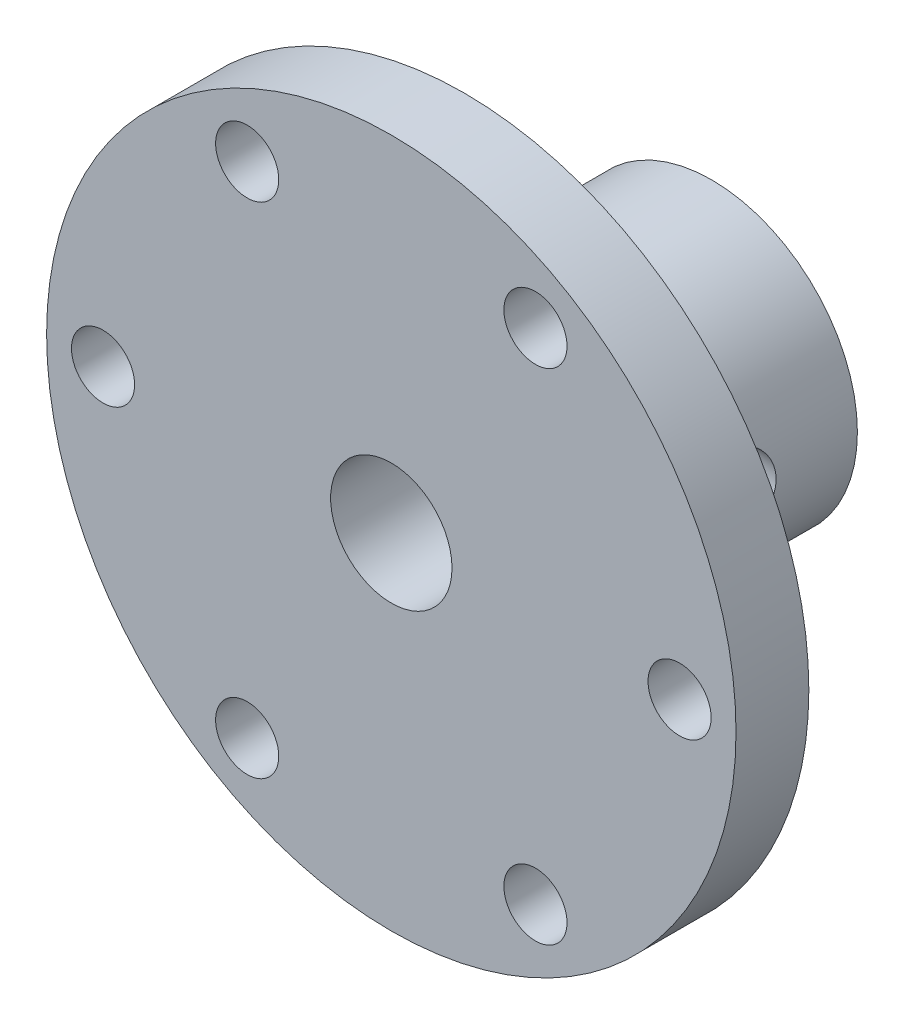
ISO-10303-21;
HEADER;
FILE_DESCRIPTION(('STEP AP214'),'2;1');
FILE_NAME('part.step','',(''),(''),'','','');
FILE_SCHEMA(('AUTOMOTIVE_DESIGN { 1 0 10303 214 1 1 1 1 }'));
ENDSEC;
DATA;
#1=APPLICATION_CONTEXT('core data for automotive mechanical design processes');
#2=APPLICATION_PROTOCOL_DEFINITION('international standard','automotive_design',2000,#1);
#3=PRODUCT_CONTEXT('',#1,'mechanical');
#4=PRODUCT('Part','Part','',(#3));
#5=PRODUCT_RELATED_PRODUCT_CATEGORY('part','',(#4));
#6=PRODUCT_DEFINITION_FORMATION('','',#4);
#7=PRODUCT_DEFINITION_CONTEXT('part definition',#1,'design');
#8=PRODUCT_DEFINITION('design','',#6,#7);
#9=PRODUCT_DEFINITION_SHAPE('','',#8);
#10=(LENGTH_UNIT() NAMED_UNIT(*) SI_UNIT(.MILLI.,.METRE.));
#11=(NAMED_UNIT(*) PLANE_ANGLE_UNIT() SI_UNIT($,.RADIAN.));
#12=(NAMED_UNIT(*) SI_UNIT($,.STERADIAN.) SOLID_ANGLE_UNIT());
#13=UNCERTAINTY_MEASURE_WITH_UNIT(LENGTH_MEASURE(1.E-05),#10,'distance_accuracy_value','');
#14=(GEOMETRIC_REPRESENTATION_CONTEXT(3) GLOBAL_UNCERTAINTY_ASSIGNED_CONTEXT((#13)) GLOBAL_UNIT_ASSIGNED_CONTEXT((#10,
#11,#12)) REPRESENTATION_CONTEXT('',''));
#15=CARTESIAN_POINT('',(0.,0.,0.));
#16=DIRECTION('',(0.,0.,1.));
#17=DIRECTION('',(1.,0.,0.));
#18=AXIS2_PLACEMENT_3D('',#15,#16,#17);
#19=CARTESIAN_POINT('',(0.,0.,6.));
#20=DIRECTION('',(0.,0.,-1.));
#21=DIRECTION('',(-1.,0.,0.));
#22=AXIS2_PLACEMENT_3D('',#19,#20,#21);
#23=CYLINDRICAL_SURFACE('',#22,28.4);
#24=CARTESIAN_POINT('',(0.,0.,6.));
#25=DIRECTION('',(0.,0.,1.));
#26=DIRECTION('',(1.,0.,0.));
#27=AXIS2_PLACEMENT_3D('',#24,#25,#26);
#28=CIRCLE('',#27,28.4);
#29=CARTESIAN_POINT('',(28.4,0.,6.));
#30=VERTEX_POINT('',#29);
#31=EDGE_CURVE('E11',#30,#30,#28,.T.);
#32=ORIENTED_EDGE('',*,*,#31,.F.);
#33=EDGE_LOOP('',(#32));
#34=FACE_BOUND('',#33,.T.);
#35=CARTESIAN_POINT('',(0.,0.,0.));
#36=DIRECTION('',(0.,0.,1.));
#37=DIRECTION('',(1.,0.,0.));
#38=AXIS2_PLACEMENT_3D('',#35,#36,#37);
#39=CIRCLE('',#38,28.4);
#40=CARTESIAN_POINT('',(28.4,0.,0.));
#41=VERTEX_POINT('',#40);
#42=EDGE_CURVE('E47',#41,#41,#39,.T.);
#43=ORIENTED_EDGE('',*,*,#42,.T.);
#44=EDGE_LOOP('',(#43));
#45=FACE_BOUND('',#44,.T.);
#46=ADVANCED_FACE('F39',(#34,#45),#23,.T.);
#47=CARTESIAN_POINT('',(0.,0.,6.));
#48=DIRECTION('',(0.,0.,1.));
#49=DIRECTION('',(1.,0.,0.));
#50=AXIS2_PLACEMENT_3D('',#47,#48,#49);
#51=PLANE('',#50);
#52=CARTESIAN_POINT('',(11.8750000000002,-20.5681033398803,6.));
#53=DIRECTION('',(0.,0.,1.));
#54=DIRECTION('',(0.50000000000001,-0.866025403784433,0.));
#55=AXIS2_PLACEMENT_3D('',#52,#53,#54);
#56=CIRCLE('',#55,2.6);
#57=CARTESIAN_POINT('',(13.1750000000003,-22.8197693897198,6.));
#58=VERTEX_POINT('',#57);
#59=EDGE_CURVE('E281',#58,#58,#56,.T.);
#60=ORIENTED_EDGE('',*,*,#59,.F.);
#61=EDGE_LOOP('',(#60));
#62=FACE_BOUND('',#61,.T.);
#63=CARTESIAN_POINT('',(-11.8749999999998,-20.5681033398805,6.));
#64=DIRECTION('',(0.,0.,1.));
#65=DIRECTION('',(-0.499999999999992,-0.866025403784443,0.));
#66=AXIS2_PLACEMENT_3D('',#63,#64,#65);
#67=CIRCLE('',#66,2.6);
#68=CARTESIAN_POINT('',(-13.1749999999998,-22.8197693897201,6.));
#69=VERTEX_POINT('',#68);
#70=EDGE_CURVE('E285',#69,#69,#67,.T.);
#71=ORIENTED_EDGE('',*,*,#70,.F.);
#72=EDGE_LOOP('',(#71));
#73=FACE_BOUND('',#72,.T.);
#74=CARTESIAN_POINT('',(-23.75,0.,6.));
#75=DIRECTION('',(0.,0.,1.));
#76=DIRECTION('',(-1.,0.,0.));
#77=AXIS2_PLACEMENT_3D('',#74,#75,#76);
#78=CIRCLE('',#77,2.6);
#79=CARTESIAN_POINT('',(-26.35,0.,6.));
#80=VERTEX_POINT('',#79);
#81=EDGE_CURVE('E289',#80,#80,#78,.T.);
#82=ORIENTED_EDGE('',*,*,#81,.F.);
#83=EDGE_LOOP('',(#82));
#84=FACE_BOUND('',#83,.T.);
#85=CARTESIAN_POINT('',(-11.8750000000001,20.5681033398804,6.));
#86=DIRECTION('',(0.,0.,1.));
#87=DIRECTION('',(-0.500000000000004,0.866025403784436,0.));
#88=AXIS2_PLACEMENT_3D('',#85,#86,#87);
#89=CIRCLE('',#88,2.6);
#90=CARTESIAN_POINT('',(-13.1750000000001,22.8197693897199,6.));
#91=VERTEX_POINT('',#90);
#92=EDGE_CURVE('E292',#91,#91,#89,.T.);
#93=ORIENTED_EDGE('',*,*,#92,.F.);
#94=EDGE_LOOP('',(#93));
#95=FACE_BOUND('',#94,.T.);
#96=CARTESIAN_POINT('',(11.875,20.5681033398804,6.));
#97=DIRECTION('',(0.,0.,1.));
#98=DIRECTION('',(0.499999999999998,0.86602540378444,0.));
#99=AXIS2_PLACEMENT_3D('',#96,#97,#98);
#100=CIRCLE('',#99,2.6);
#101=CARTESIAN_POINT('',(13.1749999999999,22.81976938972,6.));
#102=VERTEX_POINT('',#101);
#103=EDGE_CURVE('E69',#102,#102,#100,.T.);
#104=ORIENTED_EDGE('',*,*,#103,.F.);
#105=EDGE_LOOP('',(#104));
#106=FACE_BOUND('',#105,.T.);
#107=CARTESIAN_POINT('',(23.75,0.,6.));
#108=DIRECTION('',(0.,0.,1.));
#109=DIRECTION('',(1.,0.,0.));
#110=AXIS2_PLACEMENT_3D('',#107,#108,#109);
#111=CIRCLE('',#110,2.6);
#112=CARTESIAN_POINT('',(26.35,0.,6.));
#113=VERTEX_POINT('',#112);
#114=EDGE_CURVE('E63',#113,#113,#111,.T.);
#115=ORIENTED_EDGE('',*,*,#114,.F.);
#116=EDGE_LOOP('',(#115));
#117=FACE_BOUND('',#116,.T.);
#118=CARTESIAN_POINT('',(0.,0.,6.));
#119=DIRECTION('',(0.,0.,1.));
#120=DIRECTION('',(1.,0.,0.));
#121=AXIS2_PLACEMENT_3D('',#118,#119,#120);
#122=CIRCLE('',#121,5.);
#123=CARTESIAN_POINT('',(5.,0.,6.));
#124=VERTEX_POINT('',#123);
#125=EDGE_CURVE('E178',#124,#124,#122,.T.);
#126=ORIENTED_EDGE('',*,*,#125,.F.);
#127=EDGE_LOOP('',(#126));
#128=FACE_BOUND('',#127,.T.);
#129=ORIENTED_EDGE('',*,*,#31,.T.);
#130=EDGE_LOOP('',(#129));
#131=FACE_BOUND('',#130,.T.);
#132=ADVANCED_FACE('F142',(#62,#73,#84,#95,#106,#117,#128,#131),#51,.T.);
#133=CARTESIAN_POINT('',(0.,0.,0.));
#134=DIRECTION('',(0.,0.,1.));
#135=DIRECTION('',(1.,0.,0.));
#136=AXIS2_PLACEMENT_3D('',#133,#134,#135);
#137=PLANE('',#136);
#138=CARTESIAN_POINT('',(11.8750000000002,-20.5681033398803,0.));
#139=DIRECTION('',(0.,0.,1.));
#140=DIRECTION('',(1.,0.,0.));
#141=AXIS2_PLACEMENT_3D('',#138,#139,#140);
#142=CIRCLE('',#141,2.6);
#143=CARTESIAN_POINT('',(14.4750000000002,-20.5681033398803,0.));
#144=VERTEX_POINT('',#143);
#145=EDGE_CURVE('E42',#144,#144,#142,.T.);
#146=ORIENTED_EDGE('',*,*,#145,.T.);
#147=EDGE_LOOP('',(#146));
#148=FACE_BOUND('',#147,.T.);
#149=CARTESIAN_POINT('',(-11.8749999999998,-20.5681033398805,0.));
#150=DIRECTION('',(0.,0.,1.));
#151=DIRECTION('',(1.,0.,0.));
#152=AXIS2_PLACEMENT_3D('',#149,#150,#151);
#153=CIRCLE('',#152,2.6);
#154=CARTESIAN_POINT('',(-9.27499999999981,-20.5681033398805,0.));
#155=VERTEX_POINT('',#154);
#156=EDGE_CURVE('E76',#155,#155,#153,.T.);
#157=ORIENTED_EDGE('',*,*,#156,.T.);
#158=EDGE_LOOP('',(#157));
#159=FACE_BOUND('',#158,.T.);
#160=CARTESIAN_POINT('',(-23.75,0.,0.));
#161=DIRECTION('',(0.,0.,1.));
#162=DIRECTION('',(1.,0.,0.));
#163=AXIS2_PLACEMENT_3D('',#160,#161,#162);
#164=CIRCLE('',#163,2.6);
#165=CARTESIAN_POINT('',(-21.15,0.,0.));
#166=VERTEX_POINT('',#165);
#167=EDGE_CURVE('E73',#166,#166,#164,.T.);
#168=ORIENTED_EDGE('',*,*,#167,.T.);
#169=EDGE_LOOP('',(#168));
#170=FACE_BOUND('',#169,.T.);
#171=CARTESIAN_POINT('',(-11.8750000000001,20.5681033398804,0.));
#172=DIRECTION('',(0.,0.,1.));
#173=DIRECTION('',(1.,0.,0.));
#174=AXIS2_PLACEMENT_3D('',#171,#172,#173);
#175=CIRCLE('',#174,2.6);
#176=CARTESIAN_POINT('',(-9.2750000000001,20.5681033398804,0.));
#177=VERTEX_POINT('',#176);
#178=EDGE_CURVE('E68',#177,#177,#175,.T.);
#179=ORIENTED_EDGE('',*,*,#178,.T.);
#180=EDGE_LOOP('',(#179));
#181=FACE_BOUND('',#180,.T.);
#182=CARTESIAN_POINT('',(11.875,20.5681033398804,0.));
#183=DIRECTION('',(0.,0.,1.));
#184=DIRECTION('',(1.,0.,0.));
#185=AXIS2_PLACEMENT_3D('',#182,#183,#184);
#186=CIRCLE('',#185,2.6);
#187=CARTESIAN_POINT('',(14.475,20.5681033398804,0.));
#188=VERTEX_POINT('',#187);
#189=EDGE_CURVE('E64',#188,#188,#186,.T.);
#190=ORIENTED_EDGE('',*,*,#189,.T.);
#191=EDGE_LOOP('',(#190));
#192=FACE_BOUND('',#191,.T.);
#193=CARTESIAN_POINT('',(23.75,0.,0.));
#194=DIRECTION('',(0.,0.,1.));
#195=DIRECTION('',(1.,0.,0.));
#196=AXIS2_PLACEMENT_3D('',#193,#194,#195);
#197=CIRCLE('',#196,2.6);
#198=CARTESIAN_POINT('',(26.35,0.,0.));
#199=VERTEX_POINT('',#198);
#200=EDGE_CURVE('E58',#199,#199,#197,.T.);
#201=ORIENTED_EDGE('',*,*,#200,.T.);
#202=EDGE_LOOP('',(#201));
#203=FACE_BOUND('',#202,.T.);
#204=CARTESIAN_POINT('',(0.,0.,0.));
#205=DIRECTION('',(0.,0.,1.));
#206=DIRECTION('',(1.,0.,0.));
#207=AXIS2_PLACEMENT_3D('',#204,#205,#206);
#208=CIRCLE('',#207,12.);
#209=CARTESIAN_POINT('',(12.,0.,0.));
#210=VERTEX_POINT('',#209);
#211=EDGE_CURVE('E183',#210,#210,#208,.T.);
#212=ORIENTED_EDGE('',*,*,#211,.T.);
#213=EDGE_LOOP('',(#212));
#214=FACE_BOUND('',#213,.T.);
#215=ORIENTED_EDGE('',*,*,#42,.F.);
#216=EDGE_LOOP('',(#215));
#217=FACE_BOUND('',#216,.T.);
#218=ADVANCED_FACE('F147',(#148,#159,#170,#181,#192,#203,#214,#217),#137,.F.);
#219=CARTESIAN_POINT('',(0.,0.,-80.7411254969543));
#220=DIRECTION('',(0.,0.,1.));
#221=DIRECTION('',(1.,0.,0.));
#222=AXIS2_PLACEMENT_3D('',#219,#220,#221);
#223=CYLINDRICAL_SURFACE('',#222,12.);
#224=CARTESIAN_POINT('',(12.,0.,-13.7));
#225=CARTESIAN_POINT('',(11.9999979586556,0.192250616036271,-13.6999970302959));
#226=CARTESIAN_POINT('',(11.9953354511183,0.384531477955751,-13.6841071800366));
#227=CARTESIAN_POINT('',(11.9771905387516,0.763509332236891,-13.6211084078635));
#228=CARTESIAN_POINT('',(11.9637050883176,0.950204373140931,-13.5739887055982));
#229=CARTESIAN_POINT('',(11.9293947573915,1.31248865854077,-13.4502259876349));
#230=CARTESIAN_POINT('',(11.9085803596471,1.48809334492485,-13.3736251249788));
#231=CARTESIAN_POINT('',(11.8617848861608,1.82396584726479,-13.1932431168002));
#232=CARTESIAN_POINT('',(11.8358032086412,1.98423187366873,-13.0894588050669));
#233=CARTESIAN_POINT('',(11.7806604879932,2.28925123773824,-12.854669968374));
#234=CARTESIAN_POINT('',(11.7514370153966,2.43352671286239,-12.7230593283338));
#235=CARTESIAN_POINT('',(11.6934839782168,2.69830333290477,-12.4376465420135));
#236=CARTESIAN_POINT('',(11.6647544919809,2.81880073775332,-12.2838409112438));
#237=CARTESIAN_POINT('',(11.6103876702424,3.03506673348075,-11.9544206657213));
#238=CARTESIAN_POINT('',(11.5848282351723,3.13026083208889,-11.7784148364674));
#239=CARTESIAN_POINT('',(11.5406246339674,3.28950782725927,-11.4120278471965));
#240=CARTESIAN_POINT('',(11.5219789097661,3.35356774120077,-11.2216499377103));
#241=CARTESIAN_POINT('',(11.4943628861755,3.44702126166811,-10.8372707405953));
#242=CARTESIAN_POINT('',(11.4851482704981,3.47729218034782,-10.6435007650703));
#243=CARTESIAN_POINT('',(11.4767101164683,3.50504692688484,-10.2534304171718));
#244=CARTESIAN_POINT('',(11.4774843054788,3.50253821271077,-10.0571306305302));
#245=CARTESIAN_POINT('',(11.4887191936464,3.46549590553055,-9.6746304908165));
#246=CARTESIAN_POINT('',(11.4988504704095,3.43205136786139,-9.48831340940649));
#247=CARTESIAN_POINT('',(11.527126483917,3.33584234995726,-9.12405837807849));
#248=CARTESIAN_POINT('',(11.5452719723879,3.27307511924567,-8.94612121592316));
#249=CARTESIAN_POINT('',(11.5878016184394,3.11917850541594,-8.60096801603822));
#250=CARTESIAN_POINT('',(11.6122643415527,3.02768856786467,-8.43392283517199));
#251=CARTESIAN_POINT('',(11.6646332095961,2.81919439549898,-8.11718646480662));
#252=CARTESIAN_POINT('',(11.6925401486543,2.70218427174075,-7.96749929300901));
#253=CARTESIAN_POINT('',(11.7499982827634,2.44052081314397,-7.68353879393927));
#254=CARTESIAN_POINT('',(11.7795709644905,2.29496079674777,-7.55010393136957));
#255=CARTESIAN_POINT('',(11.8360522550964,1.9831626177712,-7.30934915968553));
#256=CARTESIAN_POINT('',(11.8629607140512,1.81692329269061,-7.20203071972561));
#257=CARTESIAN_POINT('',(11.911305068464,1.46702054381754,-7.01608331130547));
#258=CARTESIAN_POINT('',(11.9327069585278,1.28325802439275,-6.93763138437738));
#259=CARTESIAN_POINT('',(11.9673817556147,0.904379855827121,-6.81298965829762));
#260=CARTESIAN_POINT('',(11.9806568010198,0.709267208006068,-6.76679137193347));
#261=CARTESIAN_POINT('',(11.9972477753369,0.320362396056758,-6.70934345913797));
#262=CARTESIAN_POINT('',(12.0008876520175,0.126751788929175,-6.69695658204036));
#263=CARTESIAN_POINT('',(11.9987436131005,-0.259789910421747,-6.70430775637944));
#264=CARTESIAN_POINT('',(11.9929608802413,-0.452721084882131,-6.72404177595897));
#265=CARTESIAN_POINT('',(11.9728328012932,-0.828195661328225,-6.79415117364875));
#266=CARTESIAN_POINT('',(11.958671079596,-1.01087244665599,-6.84386987979586));
#267=CARTESIAN_POINT('',(11.9234143219009,-1.3652582078424,-6.97175443866208));
#268=CARTESIAN_POINT('',(11.9023184702716,-1.53696589061412,-7.04992363800497));
#269=CARTESIAN_POINT('',(11.8548041387511,-1.8687851462497,-7.23445067584595));
#270=CARTESIAN_POINT('',(11.8282775661118,-2.02855322539993,-7.34139762189875));
#271=CARTESIAN_POINT('',(11.7729539047605,-2.32826592169756,-7.57972229843033));
#272=CARTESIAN_POINT('',(11.7441562786821,-2.46820582515108,-7.7111058210343));
#273=CARTESIAN_POINT('',(11.686305648684,-2.72924317167472,-7.99991070077944));
#274=CARTESIAN_POINT('',(11.6572775743161,-2.84953284456593,-8.15806868761665));
#275=CARTESIAN_POINT('',(11.6033077860167,-3.06191103175266,-8.49295394546947));
#276=CARTESIAN_POINT('',(11.5783659429279,-3.15400043747977,-8.66968062927741));
#277=CARTESIAN_POINT('',(11.5356829821783,-3.30670711143647,-9.03601813668265));
#278=CARTESIAN_POINT('',(11.5179055077599,-3.36748373099338,-9.22555805832233));
#279=CARTESIAN_POINT('',(11.491630637064,-3.45609644170265,-9.61279100626175));
#280=CARTESIAN_POINT('',(11.4831302795738,-3.48394304420106,-9.81048141004373));
#281=CARTESIAN_POINT('',(11.4766526103525,-3.50521790341097,-10.2000450823891));
#282=CARTESIAN_POINT('',(11.4782742503181,-3.49995782428904,-10.391841019796));
#283=CARTESIAN_POINT('',(11.490900161998,-3.45827663693376,-10.7716857857672));
#284=CARTESIAN_POINT('',(11.5019040955216,-3.42185665187857,-10.9597347491435));
#285=CARTESIAN_POINT('',(11.5317932493867,-3.31971496068278,-11.3247323660029));
#286=CARTESIAN_POINT('',(11.5505897637083,-3.25432250159356,-11.5017809508041));
#287=CARTESIAN_POINT('',(11.5939342849626,-3.09634727234553,-11.84253449225));
#288=CARTESIAN_POINT('',(11.6184833446479,-3.00375952448709,-12.0062369990763));
#289=CARTESIAN_POINT('',(11.671628714874,-2.79026256293089,-12.3217841404736));
#290=CARTESIAN_POINT('',(11.7003357803915,-2.66848324911774,-12.4730214350832));
#291=CARTESIAN_POINT('',(11.7580051332836,-2.40164905310757,-12.7533393516105));
#292=CARTESIAN_POINT('',(11.7869674838678,-2.25658824406739,-12.8824143142291));
#293=CARTESIAN_POINT('',(11.8428247984646,-1.94257034920565,-13.118219062954));
#294=CARTESIAN_POINT('',(11.8696424476485,-1.77307212722851,-13.2242483523));
#295=CARTESIAN_POINT('',(11.9172840019109,-1.41787290414846,-13.4061504991097));
#296=CARTESIAN_POINT('',(11.9381109889281,-1.23218029867212,-13.4820388704629));
#297=CARTESIAN_POINT('',(11.9693745680963,-0.873210355740786,-13.5938818986158));
#298=CARTESIAN_POINT('',(11.9807672117729,-0.701172394101379,-13.6335725411166));
#299=CARTESIAN_POINT('',(11.9960803155116,-0.352764349111694,-13.6866310212266));
#300=CARTESIAN_POINT('',(12.0000018729862,-0.176394905859389,-13.7000027247802));
#301=CARTESIAN_POINT('',(12.,0.,-13.7));
#302=B_SPLINE_CURVE_WITH_KNOTS('',3,(#224,#225,#226,#227,#228,#229,#230,#231,#232,#233,#234,
#235,#236,#237,#238,#239,#240,#241,#242,#243,#244,#245,#246,#247,#248,#249,#250,#251,#252,#253,
#254,#255,#256,#257,#258,#259,#260,#261,#262,#263,#264,#265,#266,#267,#268,#269,#270,#271,#272,
#273,#274,#275,#276,#277,#278,#279,#280,#281,#282,#283,#284,#285,#286,#287,#288,#289,#290,#291,
#292,#293,#294,#295,#296,#297,#298,#299,#300,#301),.UNSPECIFIED.,.T.,.F.,(4,2,2,2,2,2,2,2,2,2,2,
2,2,2,2,2,2,2,2,2,2,2,2,2,2,2,2,2,2,2,2,2,2,2,2,2,2,2,4),(0.,0.576104187237697,1.15240734571962,
1.72788953185147,2.3034387774941,2.8931284215342,3.48291074447771,4.08511902810721,
4.68719151611487,5.27323896361852,5.85915307688454,6.42519507621303,6.99129018109986,
7.56479650704287,8.13843531346807,8.73464999068507,9.3308981996408,9.93074460552025,
10.5304331084589,11.1096869207413,11.6888680299311,12.2558035112543,12.8228057026087,
13.4024376673981,13.9822071960267,14.5817982868413,15.181370422175,15.7778604128875,
16.3741599510242,16.9469873204324,17.5197940427923,18.0862519201113,18.6528135439337,
19.2390045690174,19.825345059982,20.4275783464265,21.0295012532639,21.5581693862251,
22.0867598582256),.UNSPECIFIED.);
#303=CARTESIAN_POINT('',(12.,0.,-13.7));
#304=VERTEX_POINT('',#303);
#305=EDGE_CURVE('E62',#304,#304,#302,.T.);
#306=ORIENTED_EDGE('',*,*,#305,.F.);
#307=EDGE_LOOP('',(#306));
#308=FACE_BOUND('',#307,.T.);
#309=CARTESIAN_POINT('',(0.,0.,-20.4));
#310=DIRECTION('',(0.,0.,1.));
#311=DIRECTION('',(1.,0.,0.));
#312=AXIS2_PLACEMENT_3D('',#309,#310,#311);
#313=CIRCLE('',#312,12.);
#314=CARTESIAN_POINT('',(12.,0.,-20.4));
#315=VERTEX_POINT('',#314);
#316=EDGE_CURVE('E53',#315,#315,#313,.F.);
#317=ORIENTED_EDGE('',*,*,#316,.F.);
#318=EDGE_LOOP('',(#317));
#319=FACE_BOUND('',#318,.T.);
#320=ORIENTED_EDGE('',*,*,#211,.F.);
#321=EDGE_LOOP('',(#320));
#322=FACE_BOUND('',#321,.T.);
#323=ADVANCED_FACE('F154',(#308,#319,#322),#223,.T.);
#324=CARTESIAN_POINT('',(0.,0.,-20.4));
#325=DIRECTION('',(0.,0.,1.));
#326=DIRECTION('',(1.,0.,0.));
#327=AXIS2_PLACEMENT_3D('',#324,#325,#326);
#328=PLANE('',#327);
#329=CARTESIAN_POINT('',(0.,0.,-20.4));
#330=DIRECTION('',(0.,0.,1.));
#331=DIRECTION('',(1.,0.,0.));
#332=AXIS2_PLACEMENT_3D('',#329,#330,#331);
#333=CIRCLE('',#332,5.);
#334=CARTESIAN_POINT('',(5.,0.,-20.4));
#335=VERTEX_POINT('',#334);
#336=EDGE_CURVE('E175',#335,#335,#333,.T.);
#337=ORIENTED_EDGE('',*,*,#336,.T.);
#338=EDGE_LOOP('',(#337));
#339=FACE_BOUND('',#338,.T.);
#340=ORIENTED_EDGE('',*,*,#316,.T.);
#341=EDGE_LOOP('',(#340));
#342=FACE_BOUND('',#341,.T.);
#343=ADVANCED_FACE('F158',(#339,#342),#328,.F.);
#344=CARTESIAN_POINT('',(0.,0.,-20.4));
#345=DIRECTION('',(0.,0.,1.));
#346=DIRECTION('',(1.,0.,0.));
#347=AXIS2_PLACEMENT_3D('',#344,#345,#346);
#348=CYLINDRICAL_SURFACE('',#347,5.);
#349=CARTESIAN_POINT('',(5.,0.,-13.7));
#350=CARTESIAN_POINT('',(5.00000042621704,0.0870043522183525,-13.7000004487662));
#351=CARTESIAN_POINT('',(4.99772447045084,0.174003012834708,-13.6967515330504));
#352=CARTESIAN_POINT('',(4.98867770301692,0.347314194586727,-13.6838092159326));
#353=CARTESIAN_POINT('',(4.98190532313284,0.433626465698281,-13.6741135661035));
#354=CARTESIAN_POINT('',(4.96402806677404,0.604838270775727,-13.6484286688144));
#355=CARTESIAN_POINT('',(4.95292394181202,0.689738047132314,-13.6324405130344));
#356=CARTESIAN_POINT('',(4.92664718548649,0.857541615637309,-13.5944127632826));
#357=CARTESIAN_POINT('',(4.91147281303202,0.940444537032612,-13.5723705795402));
#358=CARTESIAN_POINT('',(4.86050384715947,1.18445169780014,-13.4978525308701));
#359=CARTESIAN_POINT('',(4.81914978198123,1.34188511202347,-13.4368258430004));
#360=CARTESIAN_POINT('',(4.7248504210069,1.64342226800416,-13.2946779177539));
#361=CARTESIAN_POINT('',(4.67190343382707,1.78752406033636,-13.2135537479683));
#362=CARTESIAN_POINT('',(4.55294999672667,2.07281883599129,-13.025792206371));
#363=CARTESIAN_POINT('',(4.48620313255133,2.21263077144972,-12.9175342770436));
#364=CARTESIAN_POINT('',(4.34787986703411,2.47340994772192,-12.6825640432033));
#365=CARTESIAN_POINT('',(4.27629632500928,2.59434841313184,-12.5558241183599));
#366=CARTESIAN_POINT('',(4.16301906437413,2.77043321825859,-12.3413205445099));
#367=CARTESIAN_POINT('',(4.12114814248979,2.83217300660938,-12.2589816934683));
#368=CARTESIAN_POINT('',(4.03877741040551,2.94845109279401,-12.0887246064047));
#369=CARTESIAN_POINT('',(3.99827795794519,3.00298752227157,-12.0008049315887));
#370=CARTESIAN_POINT('',(3.88091849381854,3.15511672851823,-11.7291209009576));
#371=CARTESIAN_POINT('',(3.80795944870695,3.24158145123197,-11.5370055997764));
#372=CARTESIAN_POINT('',(3.70483812483702,3.3583150253545,-11.1966145058031));
#373=CARTESIAN_POINT('',(3.66842434173772,3.39769929206986,-11.053332856186));
#374=CARTESIAN_POINT('',(3.61151026705736,3.45814142842493,-10.7599782774875));
#375=CARTESIAN_POINT('',(3.5909788310104,3.47923517471286,-10.6099192535347));
#376=CARTESIAN_POINT('',(3.56906148275634,3.50172630314739,-10.3060044854445));
#377=CARTESIAN_POINT('',(3.567785357308,3.50301074075766,-10.1521319764738));
#378=CARTESIAN_POINT('',(3.58490716922728,3.48547905206288,-9.84660694102338));
#379=CARTESIAN_POINT('',(3.60331863800168,3.46664910102171,-9.69495601411412));
#380=CARTESIAN_POINT('',(3.65490422743524,3.41217455094726,-9.40817200267927));
#381=CARTESIAN_POINT('',(3.68702349344459,3.37772210034564,-9.27260939704024));
#382=CARTESIAN_POINT('',(3.76191452361164,3.29410841442847,-9.00921270160592));
#383=CARTESIAN_POINT('',(3.80469482342135,3.24493538684719,-8.88138490702493));
#384=CARTESIAN_POINT('',(3.92170358258721,3.10362288773558,-8.56886964142902));
#385=CARTESIAN_POINT('',(4.00058241582138,3.00252401271627,-8.3899542998992));
#386=CARTESIAN_POINT('',(4.16353835198786,2.77217358887505,-8.05367515006416));
#387=CARTESIAN_POINT('',(4.24762577382756,2.642864786405,-7.89635624660459));
#388=CARTESIAN_POINT('',(4.41319719993646,2.35615009551438,-7.60365852261563));
#389=CARTESIAN_POINT('',(4.49463830430188,2.19842810008499,-7.46856313178704));
#390=CARTESIAN_POINT('',(4.64571074856639,1.8579273762317,-7.22652837522964));
#391=CARTESIAN_POINT('',(4.71536646098566,1.67520180814531,-7.11953064320526));
#392=CARTESIAN_POINT('',(4.82216631911686,1.33103347938956,-6.95869958547792));
#393=CARTESIAN_POINT('',(4.86309351042242,1.17381323782198,-6.89834265224451));
#394=CARTESIAN_POINT('',(4.9301001158466,0.849391818622385,-6.80041556865873));
#395=CARTESIAN_POINT('',(4.95618964221845,0.682197524634616,-6.76282989795752));
#396=CARTESIAN_POINT('',(4.99126408812027,0.341601582307252,-6.71244369957722));
#397=CARTESIAN_POINT('',(5.00017960470658,0.168177620339825,-6.69974373550672));
#398=CARTESIAN_POINT('',(4.99981494790606,-0.178615477776584,-6.70026404649167));
#399=CARTESIAN_POINT('',(4.99053559661931,-0.351984616048679,-6.71348315044392));
#400=CARTESIAN_POINT('',(4.95588308246295,-0.681878691052439,-6.76327717146805));
#401=CARTESIAN_POINT('',(4.93159966844545,-0.838764541823675,-6.79827166631808));
#402=CARTESIAN_POINT('',(4.86988673925569,-1.14387617411518,-6.88837330066775));
#403=CARTESIAN_POINT('',(4.83245477190368,-1.29210033422852,-6.94348419191145));
#404=CARTESIAN_POINT('',(4.74402407105281,-1.58733800015477,-7.07615851442339));
#405=CARTESIAN_POINT('',(4.69225335349562,-1.7335252380801,-7.15503372198345));
#406=CARTESIAN_POINT('',(4.58018246824009,-2.0110620530274,-7.33074054119936));
#407=CARTESIAN_POINT('',(4.51987694522203,-2.14240222019462,-7.42758343896596));
#408=CARTESIAN_POINT('',(4.3837210249878,-2.41023390883475,-7.65506041745898));
#409=CARTESIAN_POINT('',(4.30697559366364,-2.54376778669948,-7.78864097343127));
#410=CARTESIAN_POINT('',(4.15319019961229,-2.78779809474485,-8.07545720847261));
#411=CARTESIAN_POINT('',(4.07615005231017,-2.8982762699034,-8.22870830838643));
#412=CARTESIAN_POINT('',(3.93636847825759,-3.0850074812227,-8.5380225300865));
#413=CARTESIAN_POINT('',(3.87296424128969,-3.1635242228457,-8.69241256766718));
#414=CARTESIAN_POINT('',(3.75915149445731,-3.29796239328923,-9.01515522954212));
#415=CARTESIAN_POINT('',(3.70871766214846,-3.35392797233398,-9.1834797861746));
#416=CARTESIAN_POINT('',(3.63690600243935,-3.43149310287235,-9.49623456971939));
#417=CARTESIAN_POINT('',(3.61171423380863,-3.45775440021167,-9.63861024263528));
#418=CARTESIAN_POINT('',(3.57824517387988,-3.4923883051313,-9.92741342236618));
#419=CARTESIAN_POINT('',(3.56994596002658,-3.5007840985696,-10.0738354273997));
#420=CARTESIAN_POINT('',(3.57159716695881,-3.49909888334034,-10.3666401809604));
#421=CARTESIAN_POINT('',(3.58156951596319,-3.48899567350593,-10.5130226711749));
#422=CARTESIAN_POINT('',(3.6181648508262,-3.45102053266417,-10.801403509118));
#423=CARTESIAN_POINT('',(3.64481215168134,-3.42312265276601,-10.9433951363493));
#424=CARTESIAN_POINT('',(3.72046646887593,-3.34096227925005,-11.2590457959494));
#425=CARTESIAN_POINT('',(3.77366378114439,-3.28147777563186,-11.4303170728968));
#426=CARTESIAN_POINT('',(3.89281979106865,-3.13919427182786,-11.7580463909688));
#427=CARTESIAN_POINT('',(3.95879827060256,-3.0563590392188,-11.91448090228));
#428=CARTESIAN_POINT('',(4.0978200574564,-2.86739904025209,-12.215010666185));
#429=CARTESIAN_POINT('',(4.17099409346797,-2.76076710805705,-12.3587238421324));
#430=CARTESIAN_POINT('',(4.31682488642117,-2.52666411670163,-12.6285488798552));
#431=CARTESIAN_POINT('',(4.38948146395,-2.3991861649975,-12.7546548943326));
#432=CARTESIAN_POINT('',(4.50037637833506,-2.18058687186093,-12.9397810125996));
#433=CARTESIAN_POINT('',(4.54058015716469,-2.09580486228961,-13.0052052550223));
#434=CARTESIAN_POINT('',(4.61781861454199,-1.9196318449831,-13.1285777942944));
#435=CARTESIAN_POINT('',(4.65485465454825,-1.82824370796614,-13.18652930833));
#436=CARTESIAN_POINT('',(4.72470170576152,-1.63930910148071,-13.294266488877));
#437=CARTESIAN_POINT('',(4.75751503472716,-1.54176605451267,-13.3440566391357));
#438=CARTESIAN_POINT('',(4.81792906327276,-1.34109196004991,-13.4347465145354));
#439=CARTESIAN_POINT('',(4.84553123458169,-1.23796250088362,-13.4756487502846));
#440=CARTESIAN_POINT('',(4.89090028372523,-1.04286308882553,-13.5423656981315));
#441=CARTESIAN_POINT('',(4.90952223595846,-0.95155030469907,-13.5695247435984));
#442=CARTESIAN_POINT('',(4.94184014789704,-0.766197984405038,-13.6164417179692));
#443=CARTESIAN_POINT('',(4.95553718934472,-0.672159051937778,-13.6362012721895));
#444=CARTESIAN_POINT('',(4.97760550276436,-0.482256943579388,-13.6679513715831));
#445=CARTESIAN_POINT('',(4.98598211980299,-0.386395698505662,-13.6799497141392));
#446=CARTESIAN_POINT('',(4.99717889255552,-0.193687228275465,-13.6959734361378));
#447=CARTESIAN_POINT('',(4.99999952559964,-0.0968400885386268,-13.6999995005013));
#448=CARTESIAN_POINT('',(5.,0.,-13.7));
#449=B_SPLINE_CURVE_WITH_KNOTS('',3,(#349,#350,#351,#352,#353,#354,#355,#356,#357,#358,#359,
#360,#361,#362,#363,#364,#365,#366,#367,#368,#369,#370,#371,#372,#373,#374,#375,#376,#377,#378,
#379,#380,#381,#382,#383,#384,#385,#386,#387,#388,#389,#390,#391,#392,#393,#394,#395,#396,#397,
#398,#399,#400,#401,#402,#403,#404,#405,#406,#407,#408,#409,#410,#411,#412,#413,#414,#415,#416,
#417,#418,#419,#420,#421,#422,#423,#424,#425,#426,#427,#428,#429,#430,#431,#432,#433,#434,#435,
#436,#437,#438,#439,#440,#441,#442,#443,#444,#445,#446,#447,#448),.UNSPECIFIED.,.T.,.F.,(4,2,2,
2,2,2,2,2,2,2,2,2,2,2,2,2,2,2,2,2,2,2,2,2,2,2,2,2,2,2,2,2,2,2,2,2,2,2,2,2,2,2,2,2,2,2,2,2,2,4),
(0.,0.260913186666067,0.52191741977439,0.782876391488196,1.04394716964421,1.56298190958995,
2.08209242616793,2.64705237592498,3.21286544833364,3.54582584040706,3.87887242451091,
4.54318175364801,5.00048193722639,5.4568830893327,5.91588549736315,6.37520358351763,
6.80419814677737,7.23353729006888,7.8904312594482,8.54867104526662,9.21474554480324,
9.87942528554154,10.3971938189047,10.9146090554214,11.4341108995647,11.953589271558,
12.439168070614,12.9248374772987,13.4448388395999,13.965167944917,14.574447250411,
15.1842071553651,15.7356049750206,16.2859179716953,16.724907060709,17.1633260811637,
17.6022716053507,18.0418586851689,18.605647020095,19.1703150249751,19.7484161780972,
20.3267088629478,20.6694660014279,21.0120750786385,21.3544952953889,21.6968186610903,
21.9876091670431,22.2783357626328,22.5687698211746,22.8591789266205),.UNSPECIFIED.);
#450=CARTESIAN_POINT('',(5.,0.,-13.7));
#451=VERTEX_POINT('',#450);
#452=EDGE_CURVE('E101',#451,#451,#449,.T.);
#453=ORIENTED_EDGE('',*,*,#452,.T.);
#454=EDGE_LOOP('',(#453));
#455=FACE_BOUND('',#454,.T.);
#456=ORIENTED_EDGE('',*,*,#336,.F.);
#457=EDGE_LOOP('',(#456));
#458=FACE_BOUND('',#457,.T.);
#459=ORIENTED_EDGE('',*,*,#125,.T.);
#460=EDGE_LOOP('',(#459));
#461=FACE_BOUND('',#460,.T.);
#462=ADVANCED_FACE('F113',(#455,#458,#461),#348,.F.);
#463=CARTESIAN_POINT('',(0.,0.,-10.2));
#464=DIRECTION('',(-1.,0.,0.));
#465=DIRECTION('',(0.,0.,1.));
#466=AXIS2_PLACEMENT_3D('',#463,#464,#465);
#467=CYLINDRICAL_SURFACE('',#466,3.5);
#468=ORIENTED_EDGE('',*,*,#305,.T.);
#469=EDGE_LOOP('',(#468));
#470=FACE_BOUND('',#469,.T.);
#471=ORIENTED_EDGE('',*,*,#452,.F.);
#472=EDGE_LOOP('',(#471));
#473=FACE_BOUND('',#472,.T.);
#474=ADVANCED_FACE('F108',(#470,#473),#467,.F.);
#475=CARTESIAN_POINT('',(23.75,0.,-20.4));
#476=DIRECTION('',(0.,0.,1.));
#477=DIRECTION('',(1.,0.,0.));
#478=AXIS2_PLACEMENT_3D('',#475,#476,#477);
#479=CYLINDRICAL_SURFACE('',#478,2.6);
#480=ORIENTED_EDGE('',*,*,#114,.T.);
#481=EDGE_LOOP('',(#480));
#482=FACE_BOUND('',#481,.T.);
#483=ORIENTED_EDGE('',*,*,#200,.F.);
#484=EDGE_LOOP('',(#483));
#485=FACE_BOUND('',#484,.T.);
#486=ADVANCED_FACE('F112',(#482,#485),#479,.F.);
#487=CARTESIAN_POINT('',(11.875,20.5681033398804,-20.4));
#488=DIRECTION('',(0.,0.,1.));
#489=DIRECTION('',(1.,0.,0.));
#490=AXIS2_PLACEMENT_3D('',#487,#488,#489);
#491=CYLINDRICAL_SURFACE('',#490,2.6);
#492=ORIENTED_EDGE('',*,*,#103,.T.);
#493=EDGE_LOOP('',(#492));
#494=FACE_BOUND('',#493,.T.);
#495=ORIENTED_EDGE('',*,*,#189,.F.);
#496=EDGE_LOOP('',(#495));
#497=FACE_BOUND('',#496,.T.);
#498=ADVANCED_FACE('F118',(#494,#497),#491,.F.);
#499=CARTESIAN_POINT('',(-11.8750000000001,20.5681033398804,-20.4));
#500=DIRECTION('',(0.,0.,1.));
#501=DIRECTION('',(1.,0.,0.));
#502=AXIS2_PLACEMENT_3D('',#499,#500,#501);
#503=CYLINDRICAL_SURFACE('',#502,2.6);
#504=ORIENTED_EDGE('',*,*,#92,.T.);
#505=EDGE_LOOP('',(#504));
#506=FACE_BOUND('',#505,.T.);
#507=ORIENTED_EDGE('',*,*,#178,.F.);
#508=EDGE_LOOP('',(#507));
#509=FACE_BOUND('',#508,.T.);
#510=ADVANCED_FACE('F121',(#506,#509),#503,.F.);
#511=CARTESIAN_POINT('',(-23.75,0.,-20.4));
#512=DIRECTION('',(0.,0.,1.));
#513=DIRECTION('',(1.,0.,0.));
#514=AXIS2_PLACEMENT_3D('',#511,#512,#513);
#515=CYLINDRICAL_SURFACE('',#514,2.6);
#516=ORIENTED_EDGE('',*,*,#81,.T.);
#517=EDGE_LOOP('',(#516));
#518=FACE_BOUND('',#517,.T.);
#519=ORIENTED_EDGE('',*,*,#167,.F.);
#520=EDGE_LOOP('',(#519));
#521=FACE_BOUND('',#520,.T.);
#522=ADVANCED_FACE('F130',(#518,#521),#515,.F.);
#523=CARTESIAN_POINT('',(-11.8749999999998,-20.5681033398805,-20.4));
#524=DIRECTION('',(0.,0.,1.));
#525=DIRECTION('',(1.,0.,0.));
#526=AXIS2_PLACEMENT_3D('',#523,#524,#525);
#527=CYLINDRICAL_SURFACE('',#526,2.6);
#528=ORIENTED_EDGE('',*,*,#70,.T.);
#529=EDGE_LOOP('',(#528));
#530=FACE_BOUND('',#529,.T.);
#531=ORIENTED_EDGE('',*,*,#156,.F.);
#532=EDGE_LOOP('',(#531));
#533=FACE_BOUND('',#532,.T.);
#534=ADVANCED_FACE('F126',(#530,#533),#527,.F.);
#535=CARTESIAN_POINT('',(11.8750000000002,-20.5681033398803,-20.4));
#536=DIRECTION('',(0.,0.,1.));
#537=DIRECTION('',(1.,0.,0.));
#538=AXIS2_PLACEMENT_3D('',#535,#536,#537);
#539=CYLINDRICAL_SURFACE('',#538,2.6);
#540=ORIENTED_EDGE('',*,*,#59,.T.);
#541=EDGE_LOOP('',(#540));
#542=FACE_BOUND('',#541,.T.);
#543=ORIENTED_EDGE('',*,*,#145,.F.);
#544=EDGE_LOOP('',(#543));
#545=FACE_BOUND('',#544,.T.);
#546=ADVANCED_FACE('F123',(#542,#545),#539,.F.);
#547=CLOSED_SHELL('',(#46,#132,#218,#323,#343,#462,#474,#486,#498,#510,#522,#534,#546));
#548=MANIFOLD_SOLID_BREP('B2',#547);
#549=ADVANCED_BREP_SHAPE_REPRESENTATION('',(#18,#548),#14);
#550=SHAPE_DEFINITION_REPRESENTATION(#9,#549);
ENDSEC;
END-ISO-10303-21;
